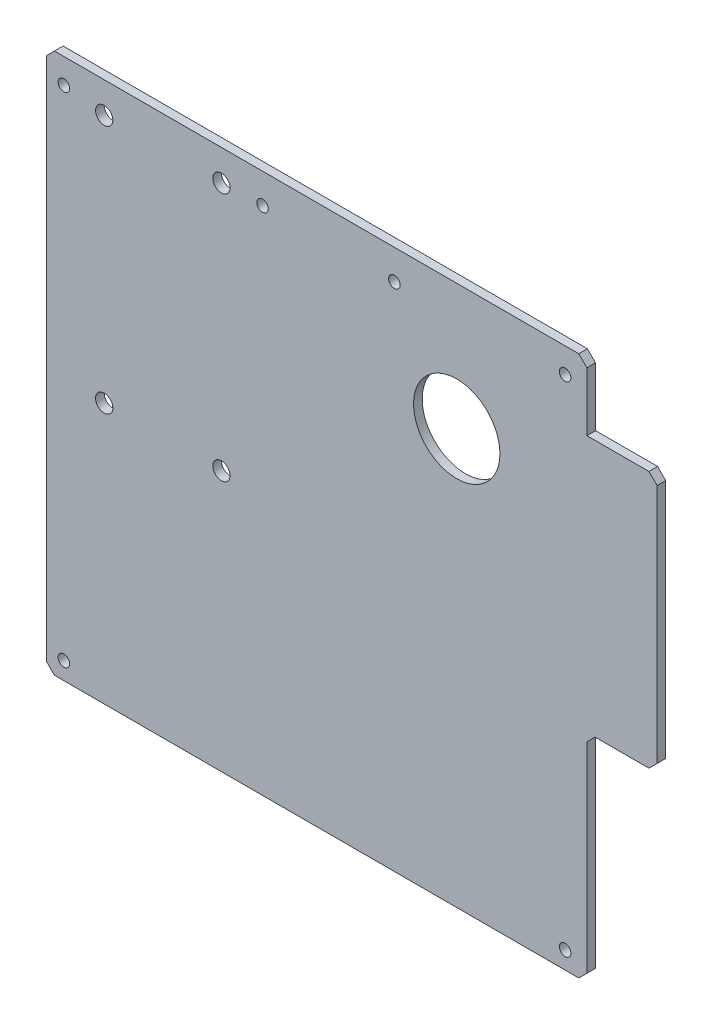
ISO-10303-21;
HEADER;
FILE_DESCRIPTION(('STEP AP214'),'2;1');
FILE_NAME('part.step','',(''),(''),'','','');
FILE_SCHEMA(('AUTOMOTIVE_DESIGN { 1 0 10303 214 1 1 1 1 }'));
ENDSEC;
DATA;
#1=APPLICATION_CONTEXT('core data for automotive mechanical design processes');
#2=APPLICATION_PROTOCOL_DEFINITION('international standard','automotive_design',2000,#1);
#3=PRODUCT_CONTEXT('',#1,'mechanical');
#4=PRODUCT('Part','Part','',(#3));
#5=PRODUCT_RELATED_PRODUCT_CATEGORY('part','',(#4));
#6=PRODUCT_DEFINITION_FORMATION('','',#4);
#7=PRODUCT_DEFINITION_CONTEXT('part definition',#1,'design');
#8=PRODUCT_DEFINITION('design','',#6,#7);
#9=PRODUCT_DEFINITION_SHAPE('','',#8);
#10=(LENGTH_UNIT() NAMED_UNIT(*) SI_UNIT(.MILLI.,.METRE.));
#11=(NAMED_UNIT(*) PLANE_ANGLE_UNIT() SI_UNIT($,.RADIAN.));
#12=(NAMED_UNIT(*) SI_UNIT($,.STERADIAN.) SOLID_ANGLE_UNIT());
#13=UNCERTAINTY_MEASURE_WITH_UNIT(LENGTH_MEASURE(1.E-05),#10,'distance_accuracy_value','');
#14=(GEOMETRIC_REPRESENTATION_CONTEXT(3) GLOBAL_UNCERTAINTY_ASSIGNED_CONTEXT((#13)) GLOBAL_UNIT_ASSIGNED_CONTEXT((#10,
#11,#12)) REPRESENTATION_CONTEXT('',''));
#15=CARTESIAN_POINT('',(0.,0.,0.));
#16=DIRECTION('',(0.,0.,1.));
#17=DIRECTION('',(1.,0.,0.));
#18=AXIS2_PLACEMENT_3D('',#15,#16,#17);
#19=CARTESIAN_POINT('',(0.,0.,1.5));
#20=DIRECTION('',(0.,0.,1.));
#21=DIRECTION('',(1.,0.,0.));
#22=AXIS2_PLACEMENT_3D('',#19,#20,#21);
#23=PLANE('',#22);
#24=CARTESIAN_POINT('',(0.,-86.5552223209638,1.5));
#25=DIRECTION('',(0.,0.,1.));
#26=DIRECTION('',(1.,0.,0.));
#27=AXIS2_PLACEMENT_3D('',#24,#25,#26);
#28=CIRCLE('',#27,0.999999999999841);
#29=CARTESIAN_POINT('',(0.999999999999841,-86.5552223209638,1.5));
#30=VERTEX_POINT('',#29);
#31=EDGE_CURVE('E359',#30,#30,#28,.T.);
#32=ORIENTED_EDGE('',*,*,#31,.F.);
#33=EDGE_LOOP('',(#32));
#34=FACE_BOUND('',#33,.T.);
#35=CARTESIAN_POINT('',(7.00290071787513,-44.3172471332476,1.5));
#36=DIRECTION('',(0.,0.,1.));
#37=DIRECTION('',(1.,0.,0.));
#38=AXIS2_PLACEMENT_3D('',#35,#36,#37);
#39=CIRCLE('',#38,1.50000000000008);
#40=CARTESIAN_POINT('',(8.5029007178752,-44.3172471332476,1.5));
#41=VERTEX_POINT('',#40);
#42=EDGE_CURVE('E371',#41,#41,#39,.T.);
#43=ORIENTED_EDGE('',*,*,#42,.F.);
#44=EDGE_LOOP('',(#43));
#45=FACE_BOUND('',#44,.T.);
#46=CARTESIAN_POINT('',(87.0793798299068,0.00310699714733964,1.5));
#47=DIRECTION('',(0.,0.,1.));
#48=DIRECTION('',(1.,0.,0.));
#49=AXIS2_PLACEMENT_3D('',#46,#47,#48);
#50=CIRCLE('',#49,0.999999999999838);
#51=CARTESIAN_POINT('',(88.0793798299066,0.00310699714733964,1.5));
#52=VERTEX_POINT('',#51);
#53=EDGE_CURVE('E383',#52,#52,#50,.T.);
#54=ORIENTED_EDGE('',*,*,#53,.F.);
#55=EDGE_LOOP('',(#54));
#56=FACE_BOUND('',#55,.T.);
#57=CARTESIAN_POINT('',(34.5090412402937,-0.868109842539377,1.5));
#58=DIRECTION('',(0.,0.,1.));
#59=DIRECTION('',(1.,0.,0.));
#60=AXIS2_PLACEMENT_3D('',#57,#58,#59);
#61=CIRCLE('',#60,0.999999999999998);
#62=CARTESIAN_POINT('',(35.5090412402937,-0.868109842539377,1.5));
#63=VERTEX_POINT('',#62);
#64=EDGE_CURVE('E395',#63,#63,#61,.T.);
#65=ORIENTED_EDGE('',*,*,#64,.F.);
#66=EDGE_LOOP('',(#65));
#67=FACE_BOUND('',#66,.T.);
#68=CARTESIAN_POINT('',(7.00290071787513,-1.01847825858581,1.5));
#69=DIRECTION('',(0.,0.,1.));
#70=DIRECTION('',(1.,0.,0.));
#71=AXIS2_PLACEMENT_3D('',#68,#69,#70);
#72=CIRCLE('',#71,1.50000000000008);
#73=CARTESIAN_POINT('',(8.5029007178752,-1.01847825858581,1.5));
#74=VERTEX_POINT('',#73);
#75=EDGE_CURVE('E407',#74,#74,#72,.T.);
#76=ORIENTED_EDGE('',*,*,#75,.F.);
#77=EDGE_LOOP('',(#76));
#78=FACE_BOUND('',#77,.T.);
#79=DIRECTION('',(-0.707106781186546,0.707106781186549,0.));
#80=VECTOR('',#79,1.);
#81=CARTESIAN_POINT('',(90.867322078492,2.92282946996818,1.5));
#82=LINE('',#81,#80);
#83=CARTESIAN_POINT('',(90.867322078492,2.92282946996818,1.5));
#84=VERTEX_POINT('',#83);
#85=CARTESIAN_POINT('',(89.4531085161189,4.33704303234128,1.5));
#86=VERTEX_POINT('',#85);
#87=EDGE_CURVE('E202',#84,#86,#82,.T.);
#88=ORIENTED_EDGE('',*,*,#87,.T.);
#89=DIRECTION('',(-1.,0.,0.));
#90=VECTOR('',#89,1.);
#91=CARTESIAN_POINT('',(89.4531085161189,4.33704303234128,1.5));
#92=LINE('',#91,#90);
#93=CARTESIAN_POINT('',(-1.64322979611291,4.33704303234127,1.5));
#94=VERTEX_POINT('',#93);
#95=EDGE_CURVE('E115',#86,#94,#92,.T.);
#96=ORIENTED_EDGE('',*,*,#95,.T.);
#97=DIRECTION('',(-0.707106781186546,-0.707106781186549,0.));
#98=VECTOR('',#97,1.);
#99=CARTESIAN_POINT('',(-1.64322979611291,4.33704303234127,1.5));
#100=LINE('',#99,#98);
#101=CARTESIAN_POINT('',(-3.057443358486,2.92282946996818,1.5));
#102=VERTEX_POINT('',#101);
#103=EDGE_CURVE('E238',#94,#102,#100,.T.);
#104=ORIENTED_EDGE('',*,*,#103,.T.);
#105=DIRECTION('',(0.,-1.,0.));
#106=VECTOR('',#105,1.);
#107=CARTESIAN_POINT('',(-3.057443358486,2.92282946996818,1.5));
#108=LINE('',#107,#106);
#109=CARTESIAN_POINT('',(-3.05744335848598,-88.1735088422632,1.5));
#110=VERTEX_POINT('',#109);
#111=EDGE_CURVE('E257',#102,#110,#108,.T.);
#112=ORIENTED_EDGE('',*,*,#111,.T.);
#113=DIRECTION('',(0.707106781186546,-0.707106781186549,0.));
#114=VECTOR('',#113,1.);
#115=CARTESIAN_POINT('',(-3.05744335848598,-88.1735088422632,1.5));
#116=LINE('',#115,#114);
#117=CARTESIAN_POINT('',(-1.64322979611289,-89.5877224046363,1.5));
#118=VERTEX_POINT('',#117);
#119=EDGE_CURVE('E254',#110,#118,#116,.T.);
#120=ORIENTED_EDGE('',*,*,#119,.T.);
#121=DIRECTION('',(1.,0.,0.));
#122=VECTOR('',#121,1.);
#123=CARTESIAN_POINT('',(-1.64322979611289,-89.5877224046363,1.5));
#124=LINE('',#123,#122);
#125=CARTESIAN_POINT('',(89.4531085161188,-89.5877224046363,1.5));
#126=VERTEX_POINT('',#125);
#127=EDGE_CURVE('E256',#118,#126,#124,.T.);
#128=ORIENTED_EDGE('',*,*,#127,.T.);
#129=DIRECTION('',(0.707106781186547,0.707106781186547,0.));
#130=VECTOR('',#129,1.);
#131=CARTESIAN_POINT('',(89.4531085161188,-89.5877224046363,1.5));
#132=LINE('',#131,#130);
#133=CARTESIAN_POINT('',(90.8673220784919,-88.1735088422632,1.5));
#134=VERTEX_POINT('',#133);
#135=EDGE_CURVE('E259',#126,#134,#132,.T.);
#136=ORIENTED_EDGE('',*,*,#135,.T.);
#137=DIRECTION('',(0.,1.,0.));
#138=VECTOR('',#137,1.);
#139=CARTESIAN_POINT('',(90.8673220784919,-88.1735088422632,1.5));
#140=LINE('',#139,#138);
#141=CARTESIAN_POINT('',(90.8673220784919,-53.3416574959021,1.5));
#142=VERTEX_POINT('',#141);
#143=EDGE_CURVE('E265',#134,#142,#140,.T.);
#144=ORIENTED_EDGE('',*,*,#143,.T.);
#145=DIRECTION('',(0.707106781186549,0.707106781186546,0.));
#146=VECTOR('',#145,1.);
#147=CARTESIAN_POINT('',(90.8673220784919,-53.3416574959021,1.5));
#148=LINE('',#147,#146);
#149=CARTESIAN_POINT('',(92.281535640865,-51.927443933529,1.5));
#150=VERTEX_POINT('',#149);
#151=EDGE_CURVE('E267',#142,#150,#148,.T.);
#152=ORIENTED_EDGE('',*,*,#151,.T.);
#153=DIRECTION('',(1.,0.,0.));
#154=VECTOR('',#153,1.);
#155=CARTESIAN_POINT('',(92.281535640865,-51.927443933529,1.5));
#156=LINE('',#155,#154);
#157=CARTESIAN_POINT('',(101.643338185774,-51.927443933529,1.5));
#158=VERTEX_POINT('',#157);
#159=EDGE_CURVE('E269',#150,#158,#156,.T.);
#160=ORIENTED_EDGE('',*,*,#159,.T.);
#161=DIRECTION('',(0.707106781186547,0.707106781186547,0.));
#162=VECTOR('',#161,1.);
#163=CARTESIAN_POINT('',(101.643338185774,-51.927443933529,1.5));
#164=LINE('',#163,#162);
#165=CARTESIAN_POINT('',(103.057551748147,-50.5132303711559,1.5));
#166=VERTEX_POINT('',#165);
#167=EDGE_CURVE('E271',#158,#166,#164,.T.);
#168=ORIENTED_EDGE('',*,*,#167,.T.);
#169=DIRECTION('',(0.,1.,0.));
#170=VECTOR('',#169,1.);
#171=CARTESIAN_POINT('',(103.057551748147,-50.5132303711559,1.5));
#172=LINE('',#171,#170);
#173=CARTESIAN_POINT('',(103.057551748147,-8.69292339895869,1.5));
#174=VERTEX_POINT('',#173);
#175=EDGE_CURVE('E155',#166,#174,#172,.T.);
#176=ORIENTED_EDGE('',*,*,#175,.T.);
#177=DIRECTION('',(-0.707106781186554,0.707106781186541,0.));
#178=VECTOR('',#177,1.);
#179=CARTESIAN_POINT('',(103.057551748147,-8.69292339895869,1.5));
#180=LINE('',#179,#178);
#181=CARTESIAN_POINT('',(101.643338185774,-7.27870983658562,1.5));
#182=VERTEX_POINT('',#181);
#183=EDGE_CURVE('E149',#174,#182,#180,.T.);
#184=ORIENTED_EDGE('',*,*,#183,.T.);
#185=DIRECTION('',(-1.,0.,0.));
#186=VECTOR('',#185,1.);
#187=CARTESIAN_POINT('',(101.643338185774,-7.27870983658562,1.5));
#188=LINE('',#187,#186);
#189=CARTESIAN_POINT('',(90.8673220784919,-7.27870983658563,1.5));
#190=VERTEX_POINT('',#189);
#191=EDGE_CURVE('E153',#182,#190,#188,.T.);
#192=ORIENTED_EDGE('',*,*,#191,.T.);
#193=DIRECTION('',(0.,1.,0.));
#194=VECTOR('',#193,1.);
#195=CARTESIAN_POINT('',(90.8673220784919,-7.27870983658563,1.5));
#196=LINE('',#195,#194);
#197=EDGE_CURVE('E51',#190,#84,#196,.T.);
#198=ORIENTED_EDGE('',*,*,#197,.T.);
#199=EDGE_LOOP('',(#88,#96,#104,#112,#120,#128,#136,#144,#152,#160,#168,#176,#184,#192,#198));
#200=FACE_BOUND('',#199,.T.);
#201=CARTESIAN_POINT('',(0.,0.,1.5));
#202=DIRECTION('',(0.,0.,1.));
#203=DIRECTION('',(1.,0.,0.));
#204=AXIS2_PLACEMENT_3D('',#201,#202,#203);
#205=CIRCLE('',#204,0.999999999999839);
#206=CARTESIAN_POINT('',(0.999999999999839,0.,1.5));
#207=VERTEX_POINT('',#206);
#208=EDGE_CURVE('E177',#207,#207,#205,.T.);
#209=ORIENTED_EDGE('',*,*,#208,.F.);
#210=EDGE_LOOP('',(#209));
#211=FACE_BOUND('',#210,.T.);
#212=CARTESIAN_POINT('',(27.3718188735983,-1.01847825858581,1.5));
#213=DIRECTION('',(0.,0.,1.));
#214=DIRECTION('',(1.,0.,0.));
#215=AXIS2_PLACEMENT_3D('',#212,#213,#214);
#216=CIRCLE('',#215,1.50000000000008);
#217=CARTESIAN_POINT('',(28.8718188735984,-1.01847825858581,1.5));
#218=VERTEX_POINT('',#217);
#219=EDGE_CURVE('E401',#218,#218,#216,.T.);
#220=ORIENTED_EDGE('',*,*,#219,.F.);
#221=EDGE_LOOP('',(#220));
#222=FACE_BOUND('',#221,.T.);
#223=CARTESIAN_POINT('',(57.4135256428072,-0.868109842539377,1.5));
#224=DIRECTION('',(0.,0.,1.));
#225=DIRECTION('',(1.,0.,0.));
#226=AXIS2_PLACEMENT_3D('',#223,#224,#225);
#227=CIRCLE('',#226,0.999999999999998);
#228=CARTESIAN_POINT('',(58.4135256428072,-0.868109842539377,1.5));
#229=VERTEX_POINT('',#228);
#230=EDGE_CURVE('E389',#229,#229,#227,.T.);
#231=ORIENTED_EDGE('',*,*,#230,.F.);
#232=EDGE_LOOP('',(#231));
#233=FACE_BOUND('',#232,.T.);
#234=CARTESIAN_POINT('',(68.2506951721249,-17.5588520296848,1.5));
#235=DIRECTION('',(0.,0.,1.));
#236=DIRECTION('',(1.,0.,0.));
#237=AXIS2_PLACEMENT_3D('',#234,#235,#236);
#238=CIRCLE('',#237,7.50249488085252);
#239=CARTESIAN_POINT('',(75.7531900529774,-17.5588520296848,1.5));
#240=VERTEX_POINT('',#239);
#241=EDGE_CURVE('E377',#240,#240,#238,.T.);
#242=ORIENTED_EDGE('',*,*,#241,.F.);
#243=EDGE_LOOP('',(#242));
#244=FACE_BOUND('',#243,.T.);
#245=CARTESIAN_POINT('',(27.3718188735983,-44.3172471332476,1.5));
#246=DIRECTION('',(0.,0.,1.));
#247=DIRECTION('',(1.,0.,0.));
#248=AXIS2_PLACEMENT_3D('',#245,#246,#247);
#249=CIRCLE('',#248,1.50000000000008);
#250=CARTESIAN_POINT('',(28.8718188735984,-44.3172471332476,1.5));
#251=VERTEX_POINT('',#250);
#252=EDGE_CURVE('E365',#251,#251,#249,.T.);
#253=ORIENTED_EDGE('',*,*,#252,.F.);
#254=EDGE_LOOP('',(#253));
#255=FACE_BOUND('',#254,.T.);
#256=CARTESIAN_POINT('',(87.0793798299068,-86.5552223209638,1.5));
#257=DIRECTION('',(0.,0.,1.));
#258=DIRECTION('',(1.,0.,0.));
#259=AXIS2_PLACEMENT_3D('',#256,#257,#258);
#260=CIRCLE('',#259,0.999999999999836);
#261=CARTESIAN_POINT('',(88.0793798299066,-86.5552223209638,1.5));
#262=VERTEX_POINT('',#261);
#263=EDGE_CURVE('E350',#262,#262,#260,.T.);
#264=ORIENTED_EDGE('',*,*,#263,.F.);
#265=EDGE_LOOP('',(#264));
#266=FACE_BOUND('',#265,.T.);
#267=ADVANCED_FACE('F34',(#34,#45,#56,#67,#78,#200,#211,#222,#233,#244,#255,#266),#23,.T.);
#268=CARTESIAN_POINT('',(0.,0.,0.));
#269=DIRECTION('',(0.,0.,1.));
#270=DIRECTION('',(1.,0.,0.));
#271=AXIS2_PLACEMENT_3D('',#268,#269,#270);
#272=PLANE('',#271);
#273=DIRECTION('',(-0.707106781186546,0.707106781186549,0.));
#274=VECTOR('',#273,1.);
#275=CARTESIAN_POINT('',(90.867322078492,2.92282946996818,0.));
#276=LINE('',#275,#274);
#277=CARTESIAN_POINT('',(90.867322078492,2.92282946996818,0.));
#278=VERTEX_POINT('',#277);
#279=CARTESIAN_POINT('',(89.4531085161189,4.33704303234128,0.));
#280=VERTEX_POINT('',#279);
#281=EDGE_CURVE('E173',#278,#280,#276,.T.);
#282=ORIENTED_EDGE('',*,*,#281,.F.);
#283=DIRECTION('',(0.,1.,0.));
#284=VECTOR('',#283,1.);
#285=CARTESIAN_POINT('',(90.8673220784919,-7.27870983658563,0.));
#286=LINE('',#285,#284);
#287=CARTESIAN_POINT('',(90.8673220784919,-7.27870983658563,0.));
#288=VERTEX_POINT('',#287);
#289=EDGE_CURVE('E107',#288,#278,#286,.T.);
#290=ORIENTED_EDGE('',*,*,#289,.F.);
#291=DIRECTION('',(-1.,0.,0.));
#292=VECTOR('',#291,1.);
#293=CARTESIAN_POINT('',(101.643338185774,-7.27870983658562,0.));
#294=LINE('',#293,#292);
#295=CARTESIAN_POINT('',(101.643338185774,-7.27870983658562,0.));
#296=VERTEX_POINT('',#295);
#297=EDGE_CURVE('E101',#296,#288,#294,.T.);
#298=ORIENTED_EDGE('',*,*,#297,.F.);
#299=DIRECTION('',(-0.707106781186554,0.707106781186541,0.));
#300=VECTOR('',#299,1.);
#301=CARTESIAN_POINT('',(103.057551748147,-8.69292339895869,0.));
#302=LINE('',#301,#300);
#303=CARTESIAN_POINT('',(103.057551748147,-8.69292339895869,0.));
#304=VERTEX_POINT('',#303);
#305=EDGE_CURVE('E163',#304,#296,#302,.T.);
#306=ORIENTED_EDGE('',*,*,#305,.F.);
#307=DIRECTION('',(0.,1.,0.));
#308=VECTOR('',#307,1.);
#309=CARTESIAN_POINT('',(103.057551748147,-50.5132303711559,0.));
#310=LINE('',#309,#308);
#311=CARTESIAN_POINT('',(103.057551748147,-50.5132303711559,0.));
#312=VERTEX_POINT('',#311);
#313=EDGE_CURVE('E197',#312,#304,#310,.T.);
#314=ORIENTED_EDGE('',*,*,#313,.F.);
#315=DIRECTION('',(0.707106781186547,0.707106781186547,0.));
#316=VECTOR('',#315,1.);
#317=CARTESIAN_POINT('',(101.643338185774,-51.927443933529,0.));
#318=LINE('',#317,#316);
#319=CARTESIAN_POINT('',(101.643338185774,-51.927443933529,0.));
#320=VERTEX_POINT('',#319);
#321=EDGE_CURVE('E195',#320,#312,#318,.T.);
#322=ORIENTED_EDGE('',*,*,#321,.F.);
#323=DIRECTION('',(1.,0.,0.));
#324=VECTOR('',#323,1.);
#325=CARTESIAN_POINT('',(92.281535640865,-51.927443933529,0.));
#326=LINE('',#325,#324);
#327=CARTESIAN_POINT('',(92.281535640865,-51.927443933529,0.));
#328=VERTEX_POINT('',#327);
#329=EDGE_CURVE('E193',#328,#320,#326,.T.);
#330=ORIENTED_EDGE('',*,*,#329,.F.);
#331=DIRECTION('',(0.707106781186549,0.707106781186546,0.));
#332=VECTOR('',#331,1.);
#333=CARTESIAN_POINT('',(90.8673220784919,-53.3416574959021,0.));
#334=LINE('',#333,#332);
#335=CARTESIAN_POINT('',(90.8673220784919,-53.3416574959021,0.));
#336=VERTEX_POINT('',#335);
#337=EDGE_CURVE('E191',#336,#328,#334,.T.);
#338=ORIENTED_EDGE('',*,*,#337,.F.);
#339=DIRECTION('',(0.,1.,0.));
#340=VECTOR('',#339,1.);
#341=CARTESIAN_POINT('',(90.8673220784919,-88.1735088422632,0.));
#342=LINE('',#341,#340);
#343=CARTESIAN_POINT('',(90.8673220784919,-88.1735088422632,0.));
#344=VERTEX_POINT('',#343);
#345=EDGE_CURVE('E189',#344,#336,#342,.T.);
#346=ORIENTED_EDGE('',*,*,#345,.F.);
#347=DIRECTION('',(0.707106781186547,0.707106781186547,0.));
#348=VECTOR('',#347,1.);
#349=CARTESIAN_POINT('',(89.4531085161188,-89.5877224046363,0.));
#350=LINE('',#349,#348);
#351=CARTESIAN_POINT('',(89.4531085161188,-89.5877224046363,0.));
#352=VERTEX_POINT('',#351);
#353=EDGE_CURVE('E187',#352,#344,#350,.T.);
#354=ORIENTED_EDGE('',*,*,#353,.F.);
#355=DIRECTION('',(1.,0.,0.));
#356=VECTOR('',#355,1.);
#357=CARTESIAN_POINT('',(-1.64322979611289,-89.5877224046363,0.));
#358=LINE('',#357,#356);
#359=CARTESIAN_POINT('',(-1.64322979611289,-89.5877224046363,0.));
#360=VERTEX_POINT('',#359);
#361=EDGE_CURVE('E185',#360,#352,#358,.T.);
#362=ORIENTED_EDGE('',*,*,#361,.F.);
#363=DIRECTION('',(0.707106781186546,-0.707106781186549,0.));
#364=VECTOR('',#363,1.);
#365=CARTESIAN_POINT('',(-3.05744335848598,-88.1735088422632,0.));
#366=LINE('',#365,#364);
#367=CARTESIAN_POINT('',(-3.05744335848598,-88.1735088422632,0.));
#368=VERTEX_POINT('',#367);
#369=EDGE_CURVE('E183',#368,#360,#366,.T.);
#370=ORIENTED_EDGE('',*,*,#369,.F.);
#371=DIRECTION('',(0.,-1.,0.));
#372=VECTOR('',#371,1.);
#373=CARTESIAN_POINT('',(-3.057443358486,2.92282946996818,0.));
#374=LINE('',#373,#372);
#375=CARTESIAN_POINT('',(-3.057443358486,2.92282946996818,0.));
#376=VERTEX_POINT('',#375);
#377=EDGE_CURVE('E181',#376,#368,#374,.T.);
#378=ORIENTED_EDGE('',*,*,#377,.F.);
#379=DIRECTION('',(-0.707106781186546,-0.707106781186549,0.));
#380=VECTOR('',#379,1.);
#381=CARTESIAN_POINT('',(-1.64322979611291,4.33704303234127,0.));
#382=LINE('',#381,#380);
#383=CARTESIAN_POINT('',(-1.64322979611291,4.33704303234127,0.));
#384=VERTEX_POINT('',#383);
#385=EDGE_CURVE('E179',#384,#376,#382,.T.);
#386=ORIENTED_EDGE('',*,*,#385,.F.);
#387=DIRECTION('',(-1.,0.,0.));
#388=VECTOR('',#387,1.);
#389=CARTESIAN_POINT('',(89.4531085161189,4.33704303234128,0.));
#390=LINE('',#389,#388);
#391=EDGE_CURVE('E176',#280,#384,#390,.T.);
#392=ORIENTED_EDGE('',*,*,#391,.F.);
#393=EDGE_LOOP('',(#282,#290,#298,#306,#314,#322,#330,#338,#346,#354,#362,#370,#378,#386,#392));
#394=FACE_BOUND('',#393,.T.);
#395=CARTESIAN_POINT('',(0.,0.,0.));
#396=DIRECTION('',(0.,0.,1.));
#397=DIRECTION('',(1.,0.,0.));
#398=AXIS2_PLACEMENT_3D('',#395,#396,#397);
#399=CIRCLE('',#398,0.999999999999839);
#400=CARTESIAN_POINT('',(0.999999999999839,0.,0.));
#401=VERTEX_POINT('',#400);
#402=EDGE_CURVE('E410',#401,#401,#399,.T.);
#403=ORIENTED_EDGE('',*,*,#402,.T.);
#404=EDGE_LOOP('',(#403));
#405=FACE_BOUND('',#404,.T.);
#406=CARTESIAN_POINT('',(7.00290071787513,-1.01847825858581,0.));
#407=DIRECTION('',(0.,0.,1.));
#408=DIRECTION('',(1.,0.,0.));
#409=AXIS2_PLACEMENT_3D('',#406,#407,#408);
#410=CIRCLE('',#409,1.50000000000008);
#411=CARTESIAN_POINT('',(8.5029007178752,-1.01847825858581,0.));
#412=VERTEX_POINT('',#411);
#413=EDGE_CURVE('E404',#412,#412,#410,.T.);
#414=ORIENTED_EDGE('',*,*,#413,.T.);
#415=EDGE_LOOP('',(#414));
#416=FACE_BOUND('',#415,.T.);
#417=CARTESIAN_POINT('',(27.3718188735983,-1.01847825858581,0.));
#418=DIRECTION('',(0.,0.,1.));
#419=DIRECTION('',(1.,0.,0.));
#420=AXIS2_PLACEMENT_3D('',#417,#418,#419);
#421=CIRCLE('',#420,1.50000000000008);
#422=CARTESIAN_POINT('',(28.8718188735984,-1.01847825858581,0.));
#423=VERTEX_POINT('',#422);
#424=EDGE_CURVE('E398',#423,#423,#421,.T.);
#425=ORIENTED_EDGE('',*,*,#424,.T.);
#426=EDGE_LOOP('',(#425));
#427=FACE_BOUND('',#426,.T.);
#428=CARTESIAN_POINT('',(34.5090412402937,-0.868109842539377,0.));
#429=DIRECTION('',(0.,0.,1.));
#430=DIRECTION('',(1.,0.,0.));
#431=AXIS2_PLACEMENT_3D('',#428,#429,#430);
#432=CIRCLE('',#431,0.999999999999998);
#433=CARTESIAN_POINT('',(35.5090412402937,-0.868109842539377,0.));
#434=VERTEX_POINT('',#433);
#435=EDGE_CURVE('E392',#434,#434,#432,.T.);
#436=ORIENTED_EDGE('',*,*,#435,.T.);
#437=EDGE_LOOP('',(#436));
#438=FACE_BOUND('',#437,.T.);
#439=CARTESIAN_POINT('',(57.4135256428072,-0.868109842539377,0.));
#440=DIRECTION('',(0.,0.,1.));
#441=DIRECTION('',(1.,0.,0.));
#442=AXIS2_PLACEMENT_3D('',#439,#440,#441);
#443=CIRCLE('',#442,0.999999999999998);
#444=CARTESIAN_POINT('',(58.4135256428072,-0.868109842539377,0.));
#445=VERTEX_POINT('',#444);
#446=EDGE_CURVE('E386',#445,#445,#443,.T.);
#447=ORIENTED_EDGE('',*,*,#446,.T.);
#448=EDGE_LOOP('',(#447));
#449=FACE_BOUND('',#448,.T.);
#450=CARTESIAN_POINT('',(87.0793798299068,0.00310699714733964,0.));
#451=DIRECTION('',(0.,0.,1.));
#452=DIRECTION('',(1.,0.,0.));
#453=AXIS2_PLACEMENT_3D('',#450,#451,#452);
#454=CIRCLE('',#453,0.999999999999838);
#455=CARTESIAN_POINT('',(88.0793798299066,0.00310699714733964,0.));
#456=VERTEX_POINT('',#455);
#457=EDGE_CURVE('E380',#456,#456,#454,.T.);
#458=ORIENTED_EDGE('',*,*,#457,.T.);
#459=EDGE_LOOP('',(#458));
#460=FACE_BOUND('',#459,.T.);
#461=CARTESIAN_POINT('',(68.2506951721249,-17.5588520296848,0.));
#462=DIRECTION('',(0.,0.,1.));
#463=DIRECTION('',(1.,0.,0.));
#464=AXIS2_PLACEMENT_3D('',#461,#462,#463);
#465=CIRCLE('',#464,7.50249488085252);
#466=CARTESIAN_POINT('',(75.7531900529774,-17.5588520296848,0.));
#467=VERTEX_POINT('',#466);
#468=EDGE_CURVE('E374',#467,#467,#465,.T.);
#469=ORIENTED_EDGE('',*,*,#468,.T.);
#470=EDGE_LOOP('',(#469));
#471=FACE_BOUND('',#470,.T.);
#472=CARTESIAN_POINT('',(7.00290071787513,-44.3172471332476,0.));
#473=DIRECTION('',(0.,0.,1.));
#474=DIRECTION('',(1.,0.,0.));
#475=AXIS2_PLACEMENT_3D('',#472,#473,#474);
#476=CIRCLE('',#475,1.50000000000008);
#477=CARTESIAN_POINT('',(8.5029007178752,-44.3172471332476,0.));
#478=VERTEX_POINT('',#477);
#479=EDGE_CURVE('E368',#478,#478,#476,.T.);
#480=ORIENTED_EDGE('',*,*,#479,.T.);
#481=EDGE_LOOP('',(#480));
#482=FACE_BOUND('',#481,.T.);
#483=CARTESIAN_POINT('',(27.3718188735983,-44.3172471332476,0.));
#484=DIRECTION('',(0.,0.,1.));
#485=DIRECTION('',(1.,0.,0.));
#486=AXIS2_PLACEMENT_3D('',#483,#484,#485);
#487=CIRCLE('',#486,1.50000000000008);
#488=CARTESIAN_POINT('',(28.8718188735984,-44.3172471332476,0.));
#489=VERTEX_POINT('',#488);
#490=EDGE_CURVE('E362',#489,#489,#487,.T.);
#491=ORIENTED_EDGE('',*,*,#490,.T.);
#492=EDGE_LOOP('',(#491));
#493=FACE_BOUND('',#492,.T.);
#494=CARTESIAN_POINT('',(0.,-86.5552223209638,0.));
#495=DIRECTION('',(0.,0.,1.));
#496=DIRECTION('',(1.,0.,0.));
#497=AXIS2_PLACEMENT_3D('',#494,#495,#496);
#498=CIRCLE('',#497,0.999999999999841);
#499=CARTESIAN_POINT('',(0.999999999999841,-86.5552223209638,0.));
#500=VERTEX_POINT('',#499);
#501=EDGE_CURVE('E356',#500,#500,#498,.T.);
#502=ORIENTED_EDGE('',*,*,#501,.T.);
#503=EDGE_LOOP('',(#502));
#504=FACE_BOUND('',#503,.T.);
#505=CARTESIAN_POINT('',(87.0793798299068,-86.5552223209638,0.));
#506=DIRECTION('',(0.,0.,1.));
#507=DIRECTION('',(1.,0.,0.));
#508=AXIS2_PLACEMENT_3D('',#505,#506,#507);
#509=CIRCLE('',#508,0.999999999999836);
#510=CARTESIAN_POINT('',(88.0793798299066,-86.5552223209638,0.));
#511=VERTEX_POINT('',#510);
#512=EDGE_CURVE('E353',#511,#511,#509,.T.);
#513=ORIENTED_EDGE('',*,*,#512,.T.);
#514=EDGE_LOOP('',(#513));
#515=FACE_BOUND('',#514,.T.);
#516=ADVANCED_FACE('F242',(#394,#405,#416,#427,#438,#449,#460,#471,#482,#493,#504,#515),#272,.F.);
#517=CARTESIAN_POINT('',(90.867322078492,2.92282946996818,1.5));
#518=DIRECTION('',(-0.707106781186549,-0.707106781186546,0.));
#519=DIRECTION('',(0.707106781186546,-0.707106781186549,0.));
#520=AXIS2_PLACEMENT_3D('',#517,#518,#519);
#521=PLANE('',#520);
#522=ORIENTED_EDGE('',*,*,#281,.T.);
#523=DIRECTION('',(0.,0.,-1.));
#524=VECTOR('',#523,1.);
#525=CARTESIAN_POINT('',(89.4531085161189,4.33704303234128,1.5));
#526=LINE('',#525,#524);
#527=EDGE_CURVE('E11',#86,#280,#526,.T.);
#528=ORIENTED_EDGE('',*,*,#527,.F.);
#529=ORIENTED_EDGE('',*,*,#87,.F.);
#530=DIRECTION('',(0.,0.,-1.));
#531=VECTOR('',#530,1.);
#532=CARTESIAN_POINT('',(90.867322078492,2.92282946996818,1.5));
#533=LINE('',#532,#531);
#534=EDGE_CURVE('E169',#84,#278,#533,.T.);
#535=ORIENTED_EDGE('',*,*,#534,.T.);
#536=EDGE_LOOP('',(#522,#528,#529,#535));
#537=FACE_BOUND('',#536,.T.);
#538=ADVANCED_FACE('F36',(#537),#521,.F.);
#539=CARTESIAN_POINT('',(89.4531085161189,4.33704303234128,1.5));
#540=DIRECTION('',(0.,-1.,0.));
#541=DIRECTION('',(1.,0.,0.));
#542=AXIS2_PLACEMENT_3D('',#539,#540,#541);
#543=PLANE('',#542);
#544=ORIENTED_EDGE('',*,*,#391,.T.);
#545=DIRECTION('',(0.,0.,-1.));
#546=VECTOR('',#545,1.);
#547=CARTESIAN_POINT('',(-1.64322979611291,4.33704303234127,1.5));
#548=LINE('',#547,#546);
#549=EDGE_CURVE('E43',#94,#384,#548,.T.);
#550=ORIENTED_EDGE('',*,*,#549,.F.);
#551=ORIENTED_EDGE('',*,*,#95,.F.);
#552=ORIENTED_EDGE('',*,*,#527,.T.);
#553=EDGE_LOOP('',(#544,#550,#551,#552));
#554=FACE_BOUND('',#553,.T.);
#555=ADVANCED_FACE('F613',(#554),#543,.F.);
#556=CARTESIAN_POINT('',(-1.64322979611291,4.33704303234127,1.5));
#557=DIRECTION('',(0.707106781186549,-0.707106781186546,0.));
#558=DIRECTION('',(0.707106781186546,0.707106781186549,0.));
#559=AXIS2_PLACEMENT_3D('',#556,#557,#558);
#560=PLANE('',#559);
#561=ORIENTED_EDGE('',*,*,#385,.T.);
#562=DIRECTION('',(0.,0.,-1.));
#563=VECTOR('',#562,1.);
#564=CARTESIAN_POINT('',(-3.057443358486,2.92282946996818,1.5));
#565=LINE('',#564,#563);
#566=EDGE_CURVE('E230',#102,#376,#565,.T.);
#567=ORIENTED_EDGE('',*,*,#566,.F.);
#568=ORIENTED_EDGE('',*,*,#103,.F.);
#569=ORIENTED_EDGE('',*,*,#549,.T.);
#570=EDGE_LOOP('',(#561,#567,#568,#569));
#571=FACE_BOUND('',#570,.T.);
#572=ADVANCED_FACE('F236',(#571),#560,.F.);
#573=CARTESIAN_POINT('',(-3.057443358486,2.92282946996818,1.5));
#574=DIRECTION('',(1.,0.,0.));
#575=DIRECTION('',(0.,1.,0.));
#576=AXIS2_PLACEMENT_3D('',#573,#574,#575);
#577=PLANE('',#576);
#578=ORIENTED_EDGE('',*,*,#377,.T.);
#579=DIRECTION('',(0.,0.,-1.));
#580=VECTOR('',#579,1.);
#581=CARTESIAN_POINT('',(-3.05744335848598,-88.1735088422632,1.5));
#582=LINE('',#581,#580);
#583=EDGE_CURVE('E227',#110,#368,#582,.T.);
#584=ORIENTED_EDGE('',*,*,#583,.F.);
#585=ORIENTED_EDGE('',*,*,#111,.F.);
#586=ORIENTED_EDGE('',*,*,#566,.T.);
#587=EDGE_LOOP('',(#578,#584,#585,#586));
#588=FACE_BOUND('',#587,.T.);
#589=ADVANCED_FACE('F248',(#588),#577,.F.);
#590=CARTESIAN_POINT('',(-3.05744335848598,-88.1735088422632,1.5));
#591=DIRECTION('',(0.707106781186549,0.707106781186546,0.));
#592=DIRECTION('',(-0.707106781186546,0.707106781186549,0.));
#593=AXIS2_PLACEMENT_3D('',#590,#591,#592);
#594=PLANE('',#593);
#595=ORIENTED_EDGE('',*,*,#369,.T.);
#596=DIRECTION('',(0.,0.,-1.));
#597=VECTOR('',#596,1.);
#598=CARTESIAN_POINT('',(-1.64322979611289,-89.5877224046363,1.5));
#599=LINE('',#598,#597);
#600=EDGE_CURVE('E224',#118,#360,#599,.T.);
#601=ORIENTED_EDGE('',*,*,#600,.F.);
#602=ORIENTED_EDGE('',*,*,#119,.F.);
#603=ORIENTED_EDGE('',*,*,#583,.T.);
#604=EDGE_LOOP('',(#595,#601,#602,#603));
#605=FACE_BOUND('',#604,.T.);
#606=ADVANCED_FACE('F252',(#605),#594,.F.);
#607=CARTESIAN_POINT('',(-1.64322979611289,-89.5877224046363,1.5));
#608=DIRECTION('',(0.,1.,0.));
#609=DIRECTION('',(-1.,0.,0.));
#610=AXIS2_PLACEMENT_3D('',#607,#608,#609);
#611=PLANE('',#610);
#612=ORIENTED_EDGE('',*,*,#361,.T.);
#613=DIRECTION('',(0.,0.,-1.));
#614=VECTOR('',#613,1.);
#615=CARTESIAN_POINT('',(89.4531085161188,-89.5877224046363,1.5));
#616=LINE('',#615,#614);
#617=EDGE_CURVE('E221',#126,#352,#616,.T.);
#618=ORIENTED_EDGE('',*,*,#617,.F.);
#619=ORIENTED_EDGE('',*,*,#127,.F.);
#620=ORIENTED_EDGE('',*,*,#600,.T.);
#621=EDGE_LOOP('',(#612,#618,#619,#620));
#622=FACE_BOUND('',#621,.T.);
#623=ADVANCED_FACE('F578',(#622),#611,.F.);
#624=CARTESIAN_POINT('',(89.4531085161188,-89.5877224046363,1.5));
#625=DIRECTION('',(-0.707106781186548,0.707106781186548,0.));
#626=DIRECTION('',(-0.707106781186548,-0.707106781186548,0.));
#627=AXIS2_PLACEMENT_3D('',#624,#625,#626);
#628=PLANE('',#627);
#629=ORIENTED_EDGE('',*,*,#353,.T.);
#630=DIRECTION('',(0.,0.,-1.));
#631=VECTOR('',#630,1.);
#632=CARTESIAN_POINT('',(90.8673220784919,-88.1735088422632,1.5));
#633=LINE('',#632,#631);
#634=EDGE_CURVE('E218',#134,#344,#633,.T.);
#635=ORIENTED_EDGE('',*,*,#634,.F.);
#636=ORIENTED_EDGE('',*,*,#135,.F.);
#637=ORIENTED_EDGE('',*,*,#617,.T.);
#638=EDGE_LOOP('',(#629,#635,#636,#637));
#639=FACE_BOUND('',#638,.T.);
#640=ADVANCED_FACE('F568',(#639),#628,.F.);
#641=CARTESIAN_POINT('',(90.8673220784919,-88.1735088422632,1.5));
#642=DIRECTION('',(-1.,0.,0.));
#643=DIRECTION('',(0.,0.,1.));
#644=AXIS2_PLACEMENT_3D('',#641,#642,#643);
#645=PLANE('',#644);
#646=ORIENTED_EDGE('',*,*,#345,.T.);
#647=DIRECTION('',(0.,0.,-1.));
#648=VECTOR('',#647,1.);
#649=CARTESIAN_POINT('',(90.8673220784919,-53.3416574959021,1.5));
#650=LINE('',#649,#648);
#651=EDGE_CURVE('E215',#142,#336,#650,.T.);
#652=ORIENTED_EDGE('',*,*,#651,.F.);
#653=ORIENTED_EDGE('',*,*,#143,.F.);
#654=ORIENTED_EDGE('',*,*,#634,.T.);
#655=EDGE_LOOP('',(#646,#652,#653,#654));
#656=FACE_BOUND('',#655,.T.);
#657=ADVANCED_FACE('F558',(#656),#645,.F.);
#658=CARTESIAN_POINT('',(90.8673220784919,-53.3416574959021,1.5));
#659=DIRECTION('',(-0.707106781186546,0.707106781186549,0.));
#660=DIRECTION('',(-0.707106781186549,-0.707106781186546,0.));
#661=AXIS2_PLACEMENT_3D('',#658,#659,#660);
#662=PLANE('',#661);
#663=ORIENTED_EDGE('',*,*,#337,.T.);
#664=DIRECTION('',(0.,0.,-1.));
#665=VECTOR('',#664,1.);
#666=CARTESIAN_POINT('',(92.281535640865,-51.927443933529,1.5));
#667=LINE('',#666,#665);
#668=EDGE_CURVE('E212',#150,#328,#667,.T.);
#669=ORIENTED_EDGE('',*,*,#668,.F.);
#670=ORIENTED_EDGE('',*,*,#151,.F.);
#671=ORIENTED_EDGE('',*,*,#651,.T.);
#672=EDGE_LOOP('',(#663,#669,#670,#671));
#673=FACE_BOUND('',#672,.T.);
#674=ADVANCED_FACE('F548',(#673),#662,.F.);
#675=CARTESIAN_POINT('',(92.281535640865,-51.927443933529,1.5));
#676=DIRECTION('',(0.,1.,0.));
#677=DIRECTION('',(-1.,0.,0.));
#678=AXIS2_PLACEMENT_3D('',#675,#676,#677);
#679=PLANE('',#678);
#680=ORIENTED_EDGE('',*,*,#329,.T.);
#681=DIRECTION('',(0.,0.,-1.));
#682=VECTOR('',#681,1.);
#683=CARTESIAN_POINT('',(101.643338185774,-51.927443933529,1.5));
#684=LINE('',#683,#682);
#685=EDGE_CURVE('E209',#158,#320,#684,.T.);
#686=ORIENTED_EDGE('',*,*,#685,.F.);
#687=ORIENTED_EDGE('',*,*,#159,.F.);
#688=ORIENTED_EDGE('',*,*,#668,.T.);
#689=EDGE_LOOP('',(#680,#686,#687,#688));
#690=FACE_BOUND('',#689,.T.);
#691=ADVANCED_FACE('F539',(#690),#679,.F.);
#692=CARTESIAN_POINT('',(101.643338185774,-51.927443933529,1.5));
#693=DIRECTION('',(-0.707106781186548,0.707106781186548,0.));
#694=DIRECTION('',(-0.707106781186548,-0.707106781186548,0.));
#695=AXIS2_PLACEMENT_3D('',#692,#693,#694);
#696=PLANE('',#695);
#697=ORIENTED_EDGE('',*,*,#321,.T.);
#698=DIRECTION('',(0.,0.,-1.));
#699=VECTOR('',#698,1.);
#700=CARTESIAN_POINT('',(103.057551748147,-50.5132303711559,1.5));
#701=LINE('',#700,#699);
#702=EDGE_CURVE('E206',#166,#312,#701,.T.);
#703=ORIENTED_EDGE('',*,*,#702,.F.);
#704=ORIENTED_EDGE('',*,*,#167,.F.);
#705=ORIENTED_EDGE('',*,*,#685,.T.);
#706=EDGE_LOOP('',(#697,#703,#704,#705));
#707=FACE_BOUND('',#706,.T.);
#708=ADVANCED_FACE('F277',(#707),#696,.F.);
#709=CARTESIAN_POINT('',(103.057551748147,-50.5132303711559,1.5));
#710=DIRECTION('',(-1.,0.,0.));
#711=DIRECTION('',(0.,0.,1.));
#712=AXIS2_PLACEMENT_3D('',#709,#710,#711);
#713=PLANE('',#712);
#714=ORIENTED_EDGE('',*,*,#313,.T.);
#715=DIRECTION('',(0.,0.,-1.));
#716=VECTOR('',#715,1.);
#717=CARTESIAN_POINT('',(103.057551748147,-8.69292339895869,1.5));
#718=LINE('',#717,#716);
#719=EDGE_CURVE('E164',#174,#304,#718,.T.);
#720=ORIENTED_EDGE('',*,*,#719,.F.);
#721=ORIENTED_EDGE('',*,*,#175,.F.);
#722=ORIENTED_EDGE('',*,*,#702,.T.);
#723=EDGE_LOOP('',(#714,#720,#721,#722));
#724=FACE_BOUND('',#723,.T.);
#725=ADVANCED_FACE('F281',(#724),#713,.F.);
#726=CARTESIAN_POINT('',(103.057551748147,-8.69292339895869,1.5));
#727=DIRECTION('',(-0.707106781186541,-0.707106781186553,0.));
#728=DIRECTION('',(0.707106781186554,-0.707106781186542,0.));
#729=AXIS2_PLACEMENT_3D('',#726,#727,#728);
#730=PLANE('',#729);
#731=ORIENTED_EDGE('',*,*,#305,.T.);
#732=DIRECTION('',(0.,0.,-1.));
#733=VECTOR('',#732,1.);
#734=CARTESIAN_POINT('',(101.643338185774,-7.27870983658562,1.5));
#735=LINE('',#734,#733);
#736=EDGE_CURVE('E160',#182,#296,#735,.T.);
#737=ORIENTED_EDGE('',*,*,#736,.F.);
#738=ORIENTED_EDGE('',*,*,#183,.F.);
#739=ORIENTED_EDGE('',*,*,#719,.T.);
#740=EDGE_LOOP('',(#731,#737,#738,#739));
#741=FACE_BOUND('',#740,.T.);
#742=ADVANCED_FACE('F161',(#741),#730,.F.);
#743=CARTESIAN_POINT('',(101.643338185774,-7.27870983658562,1.5));
#744=DIRECTION('',(0.,-1.,0.));
#745=DIRECTION('',(1.,0.,0.));
#746=AXIS2_PLACEMENT_3D('',#743,#744,#745);
#747=PLANE('',#746);
#748=ORIENTED_EDGE('',*,*,#297,.T.);
#749=DIRECTION('',(0.,0.,-1.));
#750=VECTOR('',#749,1.);
#751=CARTESIAN_POINT('',(90.8673220784919,-7.27870983658563,1.5));
#752=LINE('',#751,#750);
#753=EDGE_CURVE('E165',#190,#288,#752,.T.);
#754=ORIENTED_EDGE('',*,*,#753,.F.);
#755=ORIENTED_EDGE('',*,*,#191,.F.);
#756=ORIENTED_EDGE('',*,*,#736,.T.);
#757=EDGE_LOOP('',(#748,#754,#755,#756));
#758=FACE_BOUND('',#757,.T.);
#759=ADVANCED_FACE('F167',(#758),#747,.F.);
#760=CARTESIAN_POINT('',(90.8673220784919,-7.27870983658563,1.5));
#761=DIRECTION('',(-1.,0.,0.));
#762=DIRECTION('',(0.,-1.,0.));
#763=AXIS2_PLACEMENT_3D('',#760,#761,#762);
#764=PLANE('',#763);
#765=ORIENTED_EDGE('',*,*,#289,.T.);
#766=ORIENTED_EDGE('',*,*,#534,.F.);
#767=ORIENTED_EDGE('',*,*,#197,.F.);
#768=ORIENTED_EDGE('',*,*,#753,.T.);
#769=EDGE_LOOP('',(#765,#766,#767,#768));
#770=FACE_BOUND('',#769,.T.);
#771=ADVANCED_FACE('F285',(#770),#764,.F.);
#772=CARTESIAN_POINT('',(0.,0.,1.5));
#773=DIRECTION('',(0.,0.,-1.));
#774=DIRECTION('',(-1.,0.,0.));
#775=AXIS2_PLACEMENT_3D('',#772,#773,#774);
#776=CYLINDRICAL_SURFACE('',#775,0.999999999999839);
#777=ORIENTED_EDGE('',*,*,#208,.T.);
#778=EDGE_LOOP('',(#777));
#779=FACE_BOUND('',#778,.T.);
#780=ORIENTED_EDGE('',*,*,#402,.F.);
#781=EDGE_LOOP('',(#780));
#782=FACE_BOUND('',#781,.T.);
#783=ADVANCED_FACE('F287',(#779,#782),#776,.F.);
#784=CARTESIAN_POINT('',(7.00290071787513,-1.01847825858581,1.5));
#785=DIRECTION('',(0.,0.,-1.));
#786=DIRECTION('',(-1.,0.,0.));
#787=AXIS2_PLACEMENT_3D('',#784,#785,#786);
#788=CYLINDRICAL_SURFACE('',#787,1.50000000000008);
#789=ORIENTED_EDGE('',*,*,#75,.T.);
#790=EDGE_LOOP('',(#789));
#791=FACE_BOUND('',#790,.T.);
#792=ORIENTED_EDGE('',*,*,#413,.F.);
#793=EDGE_LOOP('',(#792));
#794=FACE_BOUND('',#793,.T.);
#795=ADVANCED_FACE('F293',(#791,#794),#788,.F.);
#796=CARTESIAN_POINT('',(27.3718188735983,-1.01847825858581,1.5));
#797=DIRECTION('',(0.,0.,-1.));
#798=DIRECTION('',(-1.,0.,0.));
#799=AXIS2_PLACEMENT_3D('',#796,#797,#798);
#800=CYLINDRICAL_SURFACE('',#799,1.50000000000008);
#801=ORIENTED_EDGE('',*,*,#219,.T.);
#802=EDGE_LOOP('',(#801));
#803=FACE_BOUND('',#802,.T.);
#804=ORIENTED_EDGE('',*,*,#424,.F.);
#805=EDGE_LOOP('',(#804));
#806=FACE_BOUND('',#805,.T.);
#807=ADVANCED_FACE('F309',(#803,#806),#800,.F.);
#808=CARTESIAN_POINT('',(34.5090412402937,-0.868109842539377,1.5));
#809=DIRECTION('',(0.,0.,-1.));
#810=DIRECTION('',(-1.,0.,0.));
#811=AXIS2_PLACEMENT_3D('',#808,#809,#810);
#812=CYLINDRICAL_SURFACE('',#811,0.999999999999998);
#813=ORIENTED_EDGE('',*,*,#64,.T.);
#814=EDGE_LOOP('',(#813));
#815=FACE_BOUND('',#814,.T.);
#816=ORIENTED_EDGE('',*,*,#435,.F.);
#817=EDGE_LOOP('',(#816));
#818=FACE_BOUND('',#817,.T.);
#819=ADVANCED_FACE('F313',(#815,#818),#812,.F.);
#820=CARTESIAN_POINT('',(57.4135256428072,-0.868109842539377,1.5));
#821=DIRECTION('',(0.,0.,-1.));
#822=DIRECTION('',(-1.,0.,0.));
#823=AXIS2_PLACEMENT_3D('',#820,#821,#822);
#824=CYLINDRICAL_SURFACE('',#823,0.999999999999998);
#825=ORIENTED_EDGE('',*,*,#230,.T.);
#826=EDGE_LOOP('',(#825));
#827=FACE_BOUND('',#826,.T.);
#828=ORIENTED_EDGE('',*,*,#446,.F.);
#829=EDGE_LOOP('',(#828));
#830=FACE_BOUND('',#829,.T.);
#831=ADVANCED_FACE('F317',(#827,#830),#824,.F.);
#832=CARTESIAN_POINT('',(87.0793798299068,0.00310699714733964,1.5));
#833=DIRECTION('',(0.,0.,-1.));
#834=DIRECTION('',(-1.,0.,0.));
#835=AXIS2_PLACEMENT_3D('',#832,#833,#834);
#836=CYLINDRICAL_SURFACE('',#835,0.999999999999838);
#837=ORIENTED_EDGE('',*,*,#53,.T.);
#838=EDGE_LOOP('',(#837));
#839=FACE_BOUND('',#838,.T.);
#840=ORIENTED_EDGE('',*,*,#457,.F.);
#841=EDGE_LOOP('',(#840));
#842=FACE_BOUND('',#841,.T.);
#843=ADVANCED_FACE('F321',(#839,#842),#836,.F.);
#844=CARTESIAN_POINT('',(68.2506951721249,-17.5588520296848,1.5));
#845=DIRECTION('',(0.,0.,-1.));
#846=DIRECTION('',(-1.,0.,0.));
#847=AXIS2_PLACEMENT_3D('',#844,#845,#846);
#848=CYLINDRICAL_SURFACE('',#847,7.50249488085252);
#849=ORIENTED_EDGE('',*,*,#241,.T.);
#850=EDGE_LOOP('',(#849));
#851=FACE_BOUND('',#850,.T.);
#852=ORIENTED_EDGE('',*,*,#468,.F.);
#853=EDGE_LOOP('',(#852));
#854=FACE_BOUND('',#853,.T.);
#855=ADVANCED_FACE('F325',(#851,#854),#848,.F.);
#856=CARTESIAN_POINT('',(7.00290071787513,-44.3172471332476,1.5));
#857=DIRECTION('',(0.,0.,-1.));
#858=DIRECTION('',(-1.,0.,0.));
#859=AXIS2_PLACEMENT_3D('',#856,#857,#858);
#860=CYLINDRICAL_SURFACE('',#859,1.50000000000008);
#861=ORIENTED_EDGE('',*,*,#42,.T.);
#862=EDGE_LOOP('',(#861));
#863=FACE_BOUND('',#862,.T.);
#864=ORIENTED_EDGE('',*,*,#479,.F.);
#865=EDGE_LOOP('',(#864));
#866=FACE_BOUND('',#865,.T.);
#867=ADVANCED_FACE('F329',(#863,#866),#860,.F.);
#868=CARTESIAN_POINT('',(27.3718188735983,-44.3172471332476,1.5));
#869=DIRECTION('',(0.,0.,-1.));
#870=DIRECTION('',(-1.,0.,0.));
#871=AXIS2_PLACEMENT_3D('',#868,#869,#870);
#872=CYLINDRICAL_SURFACE('',#871,1.50000000000008);
#873=ORIENTED_EDGE('',*,*,#252,.T.);
#874=EDGE_LOOP('',(#873));
#875=FACE_BOUND('',#874,.T.);
#876=ORIENTED_EDGE('',*,*,#490,.F.);
#877=EDGE_LOOP('',(#876));
#878=FACE_BOUND('',#877,.T.);
#879=ADVANCED_FACE('F333',(#875,#878),#872,.F.);
#880=CARTESIAN_POINT('',(0.,-86.5552223209638,1.5));
#881=DIRECTION('',(0.,0.,-1.));
#882=DIRECTION('',(-1.,0.,0.));
#883=AXIS2_PLACEMENT_3D('',#880,#881,#882);
#884=CYLINDRICAL_SURFACE('',#883,0.999999999999841);
#885=ORIENTED_EDGE('',*,*,#31,.T.);
#886=EDGE_LOOP('',(#885));
#887=FACE_BOUND('',#886,.T.);
#888=ORIENTED_EDGE('',*,*,#501,.F.);
#889=EDGE_LOOP('',(#888));
#890=FACE_BOUND('',#889,.T.);
#891=ADVANCED_FACE('F337',(#887,#890),#884,.F.);
#892=CARTESIAN_POINT('',(87.0793798299068,-86.5552223209638,1.5));
#893=DIRECTION('',(0.,0.,-1.));
#894=DIRECTION('',(-1.,0.,0.));
#895=AXIS2_PLACEMENT_3D('',#892,#893,#894);
#896=CYLINDRICAL_SURFACE('',#895,0.999999999999836);
#897=ORIENTED_EDGE('',*,*,#263,.T.);
#898=EDGE_LOOP('',(#897));
#899=FACE_BOUND('',#898,.T.);
#900=ORIENTED_EDGE('',*,*,#512,.F.);
#901=EDGE_LOOP('',(#900));
#902=FACE_BOUND('',#901,.T.);
#903=ADVANCED_FACE('F341',(#899,#902),#896,.F.);
#904=CLOSED_SHELL('',(#267,#516,#538,#555,#572,#589,#606,#623,#640,#657,#674,#691,#708,#725,
#742,#759,#771,#783,#795,#807,#819,#831,#843,#855,#867,#879,#891,#903));
#905=MANIFOLD_SOLID_BREP('B2',#904);
#906=ADVANCED_BREP_SHAPE_REPRESENTATION('',(#18,#905),#14);
#907=SHAPE_DEFINITION_REPRESENTATION(#9,#906);
ENDSEC;
END-ISO-10303-21;
